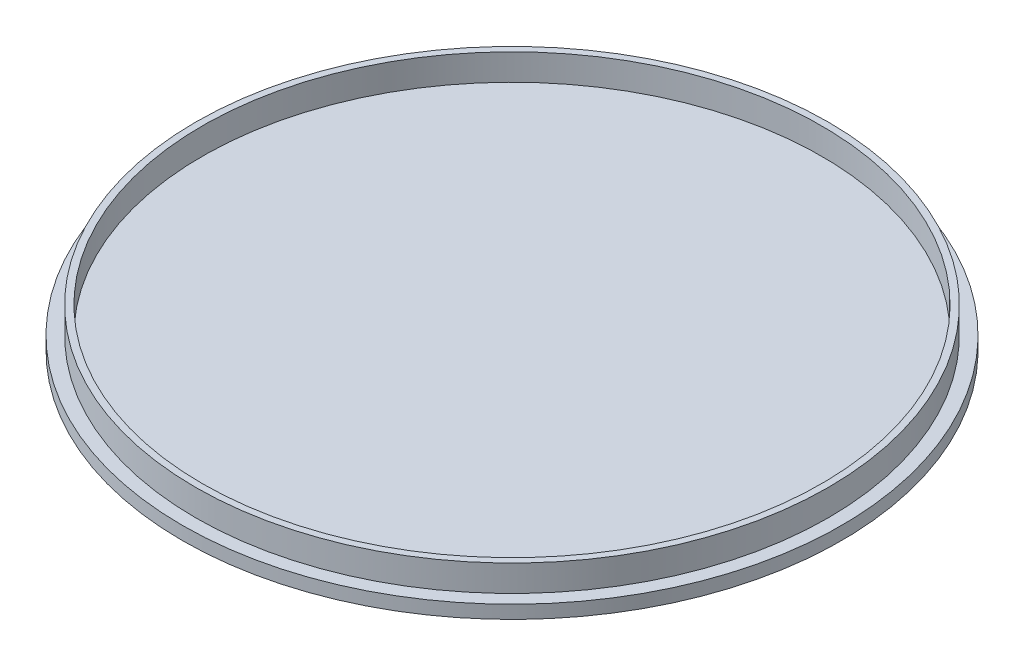
ISO-10303-21;
HEADER;
FILE_DESCRIPTION(('STEP AP214'),'2;1');
FILE_NAME('part.step','',(''),(''),'','','');
FILE_SCHEMA(('AUTOMOTIVE_DESIGN { 1 0 10303 214 1 1 1 1 }'));
ENDSEC;
DATA;
#1=APPLICATION_CONTEXT('core data for automotive mechanical design processes');
#2=APPLICATION_PROTOCOL_DEFINITION('international standard','automotive_design',2000,#1);
#3=PRODUCT_CONTEXT('',#1,'mechanical');
#4=PRODUCT('Part','Part','',(#3));
#5=PRODUCT_RELATED_PRODUCT_CATEGORY('part','',(#4));
#6=PRODUCT_DEFINITION_FORMATION('','',#4);
#7=PRODUCT_DEFINITION_CONTEXT('part definition',#1,'design');
#8=PRODUCT_DEFINITION('design','',#6,#7);
#9=PRODUCT_DEFINITION_SHAPE('','',#8);
#10=(LENGTH_UNIT() NAMED_UNIT(*) SI_UNIT(.MILLI.,.METRE.));
#11=(NAMED_UNIT(*) PLANE_ANGLE_UNIT() SI_UNIT($,.RADIAN.));
#12=(NAMED_UNIT(*) SI_UNIT($,.STERADIAN.) SOLID_ANGLE_UNIT());
#13=UNCERTAINTY_MEASURE_WITH_UNIT(LENGTH_MEASURE(1.E-05),#10,'distance_accuracy_value','');
#14=(GEOMETRIC_REPRESENTATION_CONTEXT(3) GLOBAL_UNCERTAINTY_ASSIGNED_CONTEXT((#13)) GLOBAL_UNIT_ASSIGNED_CONTEXT((#10,
#11,#12)) REPRESENTATION_CONTEXT('',''));
#15=CARTESIAN_POINT('',(0.,0.,0.));
#16=DIRECTION('',(0.,0.,1.));
#17=DIRECTION('',(1.,0.,0.));
#18=AXIS2_PLACEMENT_3D('',#15,#16,#17);
#19=CARTESIAN_POINT('',(0.,2.,0.));
#20=DIRECTION('',(0.,-1.,0.));
#21=DIRECTION('',(0.,0.,-1.));
#22=AXIS2_PLACEMENT_3D('',#19,#20,#21);
#23=CYLINDRICAL_SURFACE('',#22,50.);
#24=CARTESIAN_POINT('',(0.,2.,0.));
#25=DIRECTION('',(0.,1.,0.));
#26=DIRECTION('',(0.,0.,1.));
#27=AXIS2_PLACEMENT_3D('',#24,#25,#26);
#28=CIRCLE('',#27,50.);
#29=CARTESIAN_POINT('',(0.,2.,50.));
#30=VERTEX_POINT('',#29);
#31=EDGE_CURVE('E42',#30,#30,#28,.T.);
#32=ORIENTED_EDGE('',*,*,#31,.F.);
#33=EDGE_LOOP('',(#32));
#34=FACE_BOUND('',#33,.T.);
#35=CARTESIAN_POINT('',(0.,0.,0.));
#36=DIRECTION('',(0.,1.,0.));
#37=DIRECTION('',(0.,0.,1.));
#38=AXIS2_PLACEMENT_3D('',#35,#36,#37);
#39=CIRCLE('',#38,50.);
#40=CARTESIAN_POINT('',(0.,0.,50.));
#41=VERTEX_POINT('',#40);
#42=EDGE_CURVE('E37',#41,#41,#39,.T.);
#43=ORIENTED_EDGE('',*,*,#42,.T.);
#44=EDGE_LOOP('',(#43));
#45=FACE_BOUND('',#44,.T.);
#46=ADVANCED_FACE('F40',(#34,#45),#23,.T.);
#47=CARTESIAN_POINT('',(0.,2.,0.));
#48=DIRECTION('',(0.,1.,0.));
#49=DIRECTION('',(0.,0.,1.));
#50=AXIS2_PLACEMENT_3D('',#47,#48,#49);
#51=PLANE('',#50);
#52=CARTESIAN_POINT('',(0.,2.,0.));
#53=DIRECTION('',(0.,1.,0.));
#54=DIRECTION('',(0.,0.,1.));
#55=AXIS2_PLACEMENT_3D('',#52,#53,#54);
#56=CIRCLE('',#55,48.);
#57=CARTESIAN_POINT('',(0.,2.,48.));
#58=VERTEX_POINT('',#57);
#59=EDGE_CURVE('E10',#58,#58,#56,.T.);
#60=ORIENTED_EDGE('',*,*,#59,.F.);
#61=EDGE_LOOP('',(#60));
#62=FACE_BOUND('',#61,.T.);
#63=ORIENTED_EDGE('',*,*,#31,.T.);
#64=EDGE_LOOP('',(#63));
#65=FACE_BOUND('',#64,.T.);
#66=ADVANCED_FACE('F77',(#62,#65),#51,.T.);
#67=CARTESIAN_POINT('',(0.,0.,0.));
#68=DIRECTION('',(0.,1.,0.));
#69=DIRECTION('',(0.,0.,1.));
#70=AXIS2_PLACEMENT_3D('',#67,#68,#69);
#71=PLANE('',#70);
#72=ORIENTED_EDGE('',*,*,#42,.F.);
#73=EDGE_LOOP('',(#72));
#74=FACE_BOUND('',#73,.T.);
#75=ADVANCED_FACE('F67',(#74),#71,.F.);
#76=CARTESIAN_POINT('',(0.,6.,0.));
#77=DIRECTION('',(0.,1.,0.));
#78=DIRECTION('',(0.,0.,1.));
#79=AXIS2_PLACEMENT_3D('',#76,#77,#78);
#80=PLANE('',#79);
#81=CARTESIAN_POINT('',(0.,6.,0.));
#82=DIRECTION('',(0.,1.,0.));
#83=DIRECTION('',(0.,0.,1.));
#84=AXIS2_PLACEMENT_3D('',#81,#82,#83);
#85=CIRCLE('',#84,48.);
#86=CARTESIAN_POINT('',(0.,6.,48.));
#87=VERTEX_POINT('',#86);
#88=EDGE_CURVE('E49',#87,#87,#85,.T.);
#89=ORIENTED_EDGE('',*,*,#88,.T.);
#90=EDGE_LOOP('',(#89));
#91=FACE_BOUND('',#90,.T.);
#92=CARTESIAN_POINT('',(0.,6.,0.));
#93=DIRECTION('',(0.,1.,0.));
#94=DIRECTION('',(0.,0.,1.));
#95=AXIS2_PLACEMENT_3D('',#92,#93,#94);
#96=CIRCLE('',#95,47.);
#97=CARTESIAN_POINT('',(0.,6.,47.));
#98=VERTEX_POINT('',#97);
#99=EDGE_CURVE('E52',#98,#98,#96,.T.);
#100=ORIENTED_EDGE('',*,*,#99,.F.);
#101=EDGE_LOOP('',(#100));
#102=FACE_BOUND('',#101,.T.);
#103=ADVANCED_FACE('F64',(#91,#102),#80,.T.);
#104=CARTESIAN_POINT('',(0.,6.,0.));
#105=DIRECTION('',(0.,-1.,0.));
#106=DIRECTION('',(0.,0.,-1.));
#107=AXIS2_PLACEMENT_3D('',#104,#105,#106);
#108=CYLINDRICAL_SURFACE('',#107,48.);
#109=ORIENTED_EDGE('',*,*,#88,.F.);
#110=EDGE_LOOP('',(#109));
#111=FACE_BOUND('',#110,.T.);
#112=ORIENTED_EDGE('',*,*,#59,.T.);
#113=EDGE_LOOP('',(#112));
#114=FACE_BOUND('',#113,.T.);
#115=ADVANCED_FACE('F63',(#111,#114),#108,.T.);
#116=CARTESIAN_POINT('',(0.,6.,0.));
#117=DIRECTION('',(0.,-1.,0.));
#118=DIRECTION('',(0.,0.,-1.));
#119=AXIS2_PLACEMENT_3D('',#116,#117,#118);
#120=CYLINDRICAL_SURFACE('',#119,47.);
#121=ORIENTED_EDGE('',*,*,#99,.T.);
#122=EDGE_LOOP('',(#121));
#123=FACE_BOUND('',#122,.T.);
#124=CARTESIAN_POINT('',(0.,2.,0.));
#125=DIRECTION('',(0.,1.,0.));
#126=DIRECTION('',(0.,0.,1.));
#127=AXIS2_PLACEMENT_3D('',#124,#125,#126);
#128=CIRCLE('',#127,47.);
#129=CARTESIAN_POINT('',(0.,2.,47.));
#130=VERTEX_POINT('',#129);
#131=EDGE_CURVE('E53',#130,#130,#128,.T.);
#132=ORIENTED_EDGE('',*,*,#131,.F.);
#133=EDGE_LOOP('',(#132));
#134=FACE_BOUND('',#133,.T.);
#135=ADVANCED_FACE('F58',(#123,#134),#120,.F.);
#136=ORIENTED_EDGE('',*,*,#131,.T.);
#137=EDGE_LOOP('',(#136));
#138=FACE_BOUND('',#137,.T.);
#139=ADVANCED_FACE('F84',(#138),#51,.T.);
#140=CLOSED_SHELL('',(#46,#66,#75,#103,#115,#135,#139));
#141=MANIFOLD_SOLID_BREP('B2',#140);
#142=ADVANCED_BREP_SHAPE_REPRESENTATION('',(#18,#141),#14);
#143=SHAPE_DEFINITION_REPRESENTATION(#9,#142);
ENDSEC;
END-ISO-10303-21;
